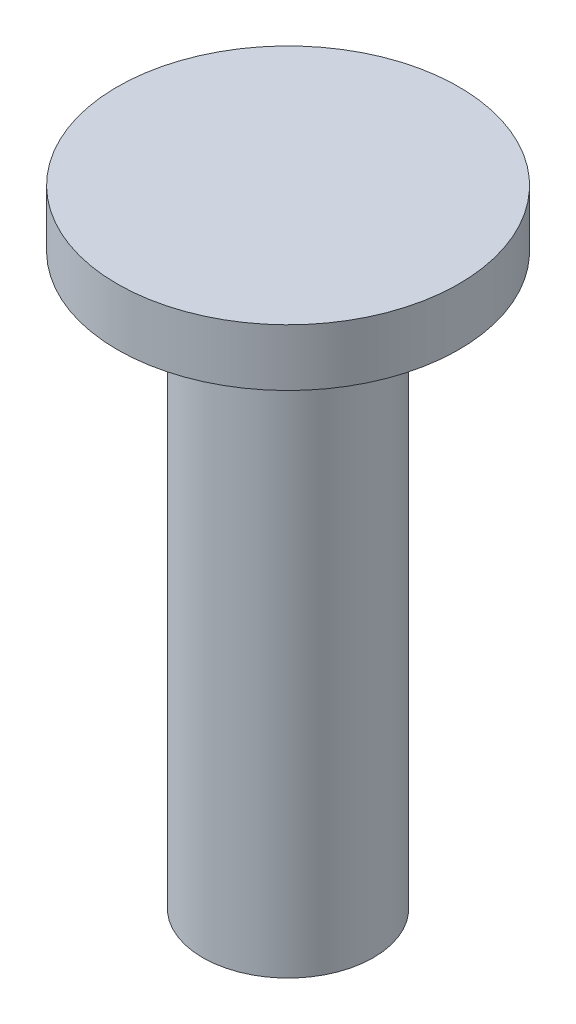
ISO-10303-21;
HEADER;
FILE_DESCRIPTION(('STEP AP214'),'2;1');
FILE_NAME('part.step','',(''),(''),'','','');
FILE_SCHEMA(('AUTOMOTIVE_DESIGN { 1 0 10303 214 1 1 1 1 }'));
ENDSEC;
DATA;
#1=APPLICATION_CONTEXT('core data for automotive mechanical design processes');
#2=APPLICATION_PROTOCOL_DEFINITION('international standard','automotive_design',2000,#1);
#3=PRODUCT_CONTEXT('',#1,'mechanical');
#4=PRODUCT('Part','Part','',(#3));
#5=PRODUCT_RELATED_PRODUCT_CATEGORY('part','',(#4));
#6=PRODUCT_DEFINITION_FORMATION('','',#4);
#7=PRODUCT_DEFINITION_CONTEXT('part definition',#1,'design');
#8=PRODUCT_DEFINITION('design','',#6,#7);
#9=PRODUCT_DEFINITION_SHAPE('','',#8);
#10=(LENGTH_UNIT() NAMED_UNIT(*) SI_UNIT(.MILLI.,.METRE.));
#11=(NAMED_UNIT(*) PLANE_ANGLE_UNIT() SI_UNIT($,.RADIAN.));
#12=(NAMED_UNIT(*) SI_UNIT($,.STERADIAN.) SOLID_ANGLE_UNIT());
#13=UNCERTAINTY_MEASURE_WITH_UNIT(LENGTH_MEASURE(1.E-05),#10,'distance_accuracy_value','');
#14=(GEOMETRIC_REPRESENTATION_CONTEXT(3) GLOBAL_UNCERTAINTY_ASSIGNED_CONTEXT((#13)) GLOBAL_UNIT_ASSIGNED_CONTEXT((#10,
#11,#12)) REPRESENTATION_CONTEXT('',''));
#15=CARTESIAN_POINT('',(0.,0.,0.));
#16=DIRECTION('',(0.,0.,1.));
#17=DIRECTION('',(1.,0.,0.));
#18=AXIS2_PLACEMENT_3D('',#15,#16,#17);
#19=CARTESIAN_POINT('',(0.,63.5,0.));
#20=DIRECTION('',(0.,-1.,0.));
#21=DIRECTION('',(0.,0.,-1.));
#22=AXIS2_PLACEMENT_3D('',#19,#20,#21);
#23=CYLINDRICAL_SURFACE('',#22,9.525);
#24=CARTESIAN_POINT('',(0.,63.5,0.));
#25=DIRECTION('',(0.,1.,0.));
#26=DIRECTION('',(0.,0.,1.));
#27=AXIS2_PLACEMENT_3D('',#24,#25,#26);
#28=CIRCLE('',#27,9.525);
#29=CARTESIAN_POINT('',(0.,63.5,9.525));
#30=VERTEX_POINT('',#29);
#31=EDGE_CURVE('E10',#30,#30,#28,.T.);
#32=ORIENTED_EDGE('',*,*,#31,.F.);
#33=EDGE_LOOP('',(#32));
#34=FACE_BOUND('',#33,.T.);
#35=CARTESIAN_POINT('',(0.,0.,0.));
#36=DIRECTION('',(0.,1.,0.));
#37=DIRECTION('',(0.,0.,1.));
#38=AXIS2_PLACEMENT_3D('',#35,#36,#37);
#39=CIRCLE('',#38,9.525);
#40=CARTESIAN_POINT('',(0.,0.,9.525));
#41=VERTEX_POINT('',#40);
#42=EDGE_CURVE('E33',#41,#41,#39,.T.);
#43=ORIENTED_EDGE('',*,*,#42,.T.);
#44=EDGE_LOOP('',(#43));
#45=FACE_BOUND('',#44,.T.);
#46=ADVANCED_FACE('F30',(#34,#45),#23,.T.);
#47=CARTESIAN_POINT('',(0.,0.,0.));
#48=DIRECTION('',(0.,1.,0.));
#49=DIRECTION('',(0.,0.,1.));
#50=AXIS2_PLACEMENT_3D('',#47,#48,#49);
#51=PLANE('',#50);
#52=ORIENTED_EDGE('',*,*,#42,.F.);
#53=EDGE_LOOP('',(#52));
#54=FACE_BOUND('',#53,.T.);
#55=ADVANCED_FACE('F53',(#54),#51,.F.);
#56=CARTESIAN_POINT('',(0.,69.85,0.));
#57=DIRECTION('',(0.,-1.,0.));
#58=DIRECTION('',(0.,0.,-1.));
#59=AXIS2_PLACEMENT_3D('',#56,#57,#58);
#60=CYLINDRICAL_SURFACE('',#59,19.05);
#61=CARTESIAN_POINT('',(0.,69.85,0.));
#62=DIRECTION('',(0.,1.,0.));
#63=DIRECTION('',(0.,0.,1.));
#64=AXIS2_PLACEMENT_3D('',#61,#62,#63);
#65=CIRCLE('',#64,19.05);
#66=CARTESIAN_POINT('',(0.,69.85,19.05));
#67=VERTEX_POINT('',#66);
#68=EDGE_CURVE('E40',#67,#67,#65,.T.);
#69=ORIENTED_EDGE('',*,*,#68,.F.);
#70=EDGE_LOOP('',(#69));
#71=FACE_BOUND('',#70,.T.);
#72=CARTESIAN_POINT('',(0.,63.5,0.));
#73=DIRECTION('',(0.,1.,0.));
#74=DIRECTION('',(0.,0.,1.));
#75=AXIS2_PLACEMENT_3D('',#72,#73,#74);
#76=CIRCLE('',#75,19.05);
#77=CARTESIAN_POINT('',(0.,63.5,19.05));
#78=VERTEX_POINT('',#77);
#79=EDGE_CURVE('E42',#78,#78,#76,.T.);
#80=ORIENTED_EDGE('',*,*,#79,.T.);
#81=EDGE_LOOP('',(#80));
#82=FACE_BOUND('',#81,.T.);
#83=ADVANCED_FACE('F50',(#71,#82),#60,.T.);
#84=CARTESIAN_POINT('',(0.,69.85,0.));
#85=DIRECTION('',(0.,1.,0.));
#86=DIRECTION('',(0.,0.,1.));
#87=AXIS2_PLACEMENT_3D('',#84,#85,#86);
#88=PLANE('',#87);
#89=ORIENTED_EDGE('',*,*,#68,.T.);
#90=EDGE_LOOP('',(#89));
#91=FACE_BOUND('',#90,.T.);
#92=ADVANCED_FACE('F48',(#91),#88,.T.);
#93=CARTESIAN_POINT('',(0.,63.5,0.));
#94=DIRECTION('',(0.,1.,0.));
#95=DIRECTION('',(0.,0.,1.));
#96=AXIS2_PLACEMENT_3D('',#93,#94,#95);
#97=PLANE('',#96);
#98=ORIENTED_EDGE('',*,*,#31,.T.);
#99=EDGE_LOOP('',(#98));
#100=FACE_BOUND('',#99,.T.);
#101=ORIENTED_EDGE('',*,*,#79,.F.);
#102=EDGE_LOOP('',(#101));
#103=FACE_BOUND('',#102,.T.);
#104=ADVANCED_FACE('F57',(#100,#103),#97,.F.);
#105=CLOSED_SHELL('',(#46,#55,#83,#92,#104));
#106=MANIFOLD_SOLID_BREP('B2',#105);
#107=ADVANCED_BREP_SHAPE_REPRESENTATION('',(#18,#106),#14);
#108=SHAPE_DEFINITION_REPRESENTATION(#9,#107);
ENDSEC;
END-ISO-10303-21;
